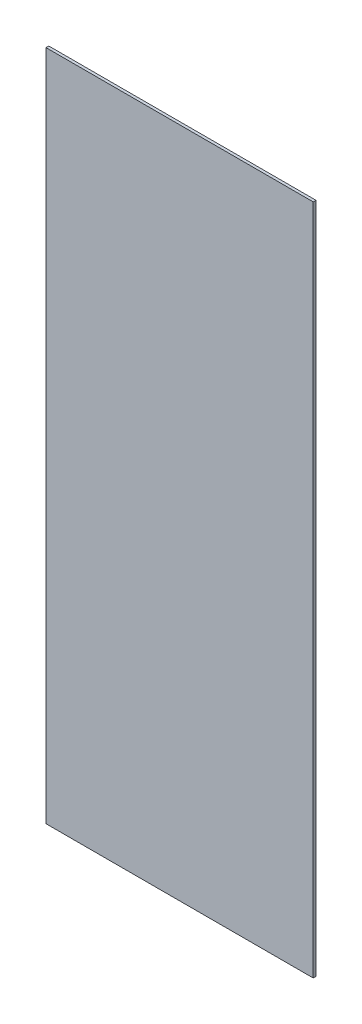
ISO-10303-21;
HEADER;
FILE_DESCRIPTION(('STEP AP214'),'2;1');
FILE_NAME('part.step','',(''),(''),'','','');
FILE_SCHEMA(('AUTOMOTIVE_DESIGN { 1 0 10303 214 1 1 1 1 }'));
ENDSEC;
DATA;
#1=APPLICATION_CONTEXT('core data for automotive mechanical design processes');
#2=APPLICATION_PROTOCOL_DEFINITION('international standard','automotive_design',2000,#1);
#3=PRODUCT_CONTEXT('',#1,'mechanical');
#4=PRODUCT('Part','Part','',(#3));
#5=PRODUCT_RELATED_PRODUCT_CATEGORY('part','',(#4));
#6=PRODUCT_DEFINITION_FORMATION('','',#4);
#7=PRODUCT_DEFINITION_CONTEXT('part definition',#1,'design');
#8=PRODUCT_DEFINITION('design','',#6,#7);
#9=PRODUCT_DEFINITION_SHAPE('','',#8);
#10=(LENGTH_UNIT() NAMED_UNIT(*) SI_UNIT(.MILLI.,.METRE.));
#11=(NAMED_UNIT(*) PLANE_ANGLE_UNIT() SI_UNIT($,.RADIAN.));
#12=(NAMED_UNIT(*) SI_UNIT($,.STERADIAN.) SOLID_ANGLE_UNIT());
#13=UNCERTAINTY_MEASURE_WITH_UNIT(LENGTH_MEASURE(1.E-05),#10,'distance_accuracy_value','');
#14=(GEOMETRIC_REPRESENTATION_CONTEXT(3) GLOBAL_UNCERTAINTY_ASSIGNED_CONTEXT((#13)) GLOBAL_UNIT_ASSIGNED_CONTEXT((#10,
#11,#12)) REPRESENTATION_CONTEXT('',''));
#15=CARTESIAN_POINT('',(0.,0.,0.));
#16=DIRECTION('',(0.,0.,1.));
#17=DIRECTION('',(1.,0.,0.));
#18=AXIS2_PLACEMENT_3D('',#15,#16,#17);
#19=CARTESIAN_POINT('',(767.157776387409,-469.763852669517,2.54));
#20=DIRECTION('',(0.,-1.,0.));
#21=DIRECTION('',(0.,0.,-1.));
#22=AXIS2_PLACEMENT_3D('',#19,#20,#21);
#23=PLANE('',#22);
#24=DIRECTION('',(-1.,0.,0.));
#25=VECTOR('',#24,1.);
#26=CARTESIAN_POINT('',(767.157776387409,-469.763852669517,0.));
#27=LINE('',#26,#25);
#28=CARTESIAN_POINT('',(1010.48977638741,-469.763852669517,0.));
#29=VERTEX_POINT('',#28);
#30=CARTESIAN_POINT('',(767.157776387409,-469.763852669517,0.));
#31=VERTEX_POINT('',#30);
#32=EDGE_CURVE('E95',#29,#31,#27,.T.);
#33=ORIENTED_EDGE('',*,*,#32,.T.);
#34=DIRECTION('',(0.,0.,-1.));
#35=VECTOR('',#34,1.);
#36=CARTESIAN_POINT('',(767.157776387409,-469.763852669517,2.54));
#37=LINE('',#36,#35);
#38=CARTESIAN_POINT('',(767.157776387409,-469.763852669517,2.54));
#39=VERTEX_POINT('',#38);
#40=EDGE_CURVE('E11',#39,#31,#37,.T.);
#41=ORIENTED_EDGE('',*,*,#40,.F.);
#42=DIRECTION('',(-1.,0.,0.));
#43=VECTOR('',#42,1.);
#44=CARTESIAN_POINT('',(767.157776387409,-469.763852669517,2.54));
#45=LINE('',#44,#43);
#46=CARTESIAN_POINT('',(1010.48977638741,-469.763852669517,2.54));
#47=VERTEX_POINT('',#46);
#48=EDGE_CURVE('E83',#47,#39,#45,.T.);
#49=ORIENTED_EDGE('',*,*,#48,.F.);
#50=DIRECTION('',(0.,0.,-1.));
#51=VECTOR('',#50,1.);
#52=CARTESIAN_POINT('',(1010.48977638741,-469.763852669517,2.54));
#53=LINE('',#52,#51);
#54=EDGE_CURVE('E91',#47,#29,#53,.T.);
#55=ORIENTED_EDGE('',*,*,#54,.T.);
#56=EDGE_LOOP('',(#33,#41,#49,#55));
#57=FACE_BOUND('',#56,.T.);
#58=ADVANCED_FACE('F32',(#57),#23,.F.);
#59=CARTESIAN_POINT('',(767.157776387409,-1081.90385266952,2.54));
#60=DIRECTION('',(1.,0.,0.));
#61=DIRECTION('',(0.,0.,-1.));
#62=AXIS2_PLACEMENT_3D('',#59,#60,#61);
#63=PLANE('',#62);
#64=DIRECTION('',(0.,-1.,0.));
#65=VECTOR('',#64,1.);
#66=CARTESIAN_POINT('',(767.157776387409,-1081.90385266952,0.));
#67=LINE('',#66,#65);
#68=CARTESIAN_POINT('',(767.157776387409,-1081.90385266952,0.));
#69=VERTEX_POINT('',#68);
#70=EDGE_CURVE('E87',#31,#69,#67,.T.);
#71=ORIENTED_EDGE('',*,*,#70,.T.);
#72=DIRECTION('',(0.,0.,-1.));
#73=VECTOR('',#72,1.);
#74=CARTESIAN_POINT('',(767.157776387409,-1081.90385266952,2.54));
#75=LINE('',#74,#73);
#76=CARTESIAN_POINT('',(767.157776387409,-1081.90385266952,2.54));
#77=VERTEX_POINT('',#76);
#78=EDGE_CURVE('E40',#77,#69,#75,.T.);
#79=ORIENTED_EDGE('',*,*,#78,.F.);
#80=DIRECTION('',(0.,-1.,0.));
#81=VECTOR('',#80,1.);
#82=CARTESIAN_POINT('',(767.157776387409,-1081.90385266952,2.54));
#83=LINE('',#82,#81);
#84=EDGE_CURVE('E78',#39,#77,#83,.T.);
#85=ORIENTED_EDGE('',*,*,#84,.F.);
#86=ORIENTED_EDGE('',*,*,#40,.T.);
#87=EDGE_LOOP('',(#71,#79,#85,#86));
#88=FACE_BOUND('',#87,.T.);
#89=ADVANCED_FACE('F86',(#88),#63,.F.);
#90=CARTESIAN_POINT('',(1010.48977638741,-1081.90385266952,2.54));
#91=DIRECTION('',(0.,1.,0.));
#92=DIRECTION('',(0.,0.,1.));
#93=AXIS2_PLACEMENT_3D('',#90,#91,#92);
#94=PLANE('',#93);
#95=DIRECTION('',(1.,0.,0.));
#96=VECTOR('',#95,1.);
#97=CARTESIAN_POINT('',(1010.48977638741,-1081.90385266952,0.));
#98=LINE('',#97,#96);
#99=CARTESIAN_POINT('',(1010.48977638741,-1081.90385266952,0.));
#100=VERTEX_POINT('',#99);
#101=EDGE_CURVE('E65',#69,#100,#98,.T.);
#102=ORIENTED_EDGE('',*,*,#101,.T.);
#103=DIRECTION('',(0.,0.,-1.));
#104=VECTOR('',#103,1.);
#105=CARTESIAN_POINT('',(1010.48977638741,-1081.90385266952,2.54));
#106=LINE('',#105,#104);
#107=CARTESIAN_POINT('',(1010.48977638741,-1081.90385266952,2.54));
#108=VERTEX_POINT('',#107);
#109=EDGE_CURVE('E88',#108,#100,#106,.T.);
#110=ORIENTED_EDGE('',*,*,#109,.F.);
#111=DIRECTION('',(1.,0.,0.));
#112=VECTOR('',#111,1.);
#113=CARTESIAN_POINT('',(1010.48977638741,-1081.90385266952,2.54));
#114=LINE('',#113,#112);
#115=EDGE_CURVE('E81',#77,#108,#114,.T.);
#116=ORIENTED_EDGE('',*,*,#115,.F.);
#117=ORIENTED_EDGE('',*,*,#78,.T.);
#118=EDGE_LOOP('',(#102,#110,#116,#117));
#119=FACE_BOUND('',#118,.T.);
#120=ADVANCED_FACE('F89',(#119),#94,.F.);
#121=CARTESIAN_POINT('',(1010.48977638741,-469.763852669517,2.54));
#122=DIRECTION('',(-1.,0.,0.));
#123=DIRECTION('',(0.,0.,1.));
#124=AXIS2_PLACEMENT_3D('',#121,#122,#123);
#125=PLANE('',#124);
#126=DIRECTION('',(0.,1.,0.));
#127=VECTOR('',#126,1.);
#128=CARTESIAN_POINT('',(1010.48977638741,-469.763852669517,0.));
#129=LINE('',#128,#127);
#130=EDGE_CURVE('E71',#100,#29,#129,.T.);
#131=ORIENTED_EDGE('',*,*,#130,.T.);
#132=ORIENTED_EDGE('',*,*,#54,.F.);
#133=DIRECTION('',(0.,1.,0.));
#134=VECTOR('',#133,1.);
#135=CARTESIAN_POINT('',(1010.48977638741,-469.763852669517,2.54));
#136=LINE('',#135,#134);
#137=EDGE_CURVE('E48',#108,#47,#136,.T.);
#138=ORIENTED_EDGE('',*,*,#137,.F.);
#139=ORIENTED_EDGE('',*,*,#109,.T.);
#140=EDGE_LOOP('',(#131,#132,#138,#139));
#141=FACE_BOUND('',#140,.T.);
#142=ADVANCED_FACE('F102',(#141),#125,.F.);
#143=CARTESIAN_POINT('',(0.,0.,2.54));
#144=DIRECTION('',(0.,0.,-1.));
#145=DIRECTION('',(-1.,0.,0.));
#146=AXIS2_PLACEMENT_3D('',#143,#144,#145);
#147=PLANE('',#146);
#148=ORIENTED_EDGE('',*,*,#48,.T.);
#149=ORIENTED_EDGE('',*,*,#84,.T.);
#150=ORIENTED_EDGE('',*,*,#115,.T.);
#151=ORIENTED_EDGE('',*,*,#137,.T.);
#152=EDGE_LOOP('',(#148,#149,#150,#151));
#153=FACE_BOUND('',#152,.T.);
#154=ADVANCED_FACE('F79',(#153),#147,.F.);
#155=CARTESIAN_POINT('',(0.,0.,0.));
#156=DIRECTION('',(0.,0.,-1.));
#157=DIRECTION('',(-1.,0.,0.));
#158=AXIS2_PLACEMENT_3D('',#155,#156,#157);
#159=PLANE('',#158);
#160=ORIENTED_EDGE('',*,*,#32,.F.);
#161=ORIENTED_EDGE('',*,*,#130,.F.);
#162=ORIENTED_EDGE('',*,*,#101,.F.);
#163=ORIENTED_EDGE('',*,*,#70,.F.);
#164=EDGE_LOOP('',(#160,#161,#162,#163));
#165=FACE_BOUND('',#164,.T.);
#166=ADVANCED_FACE('F105',(#165),#159,.T.);
#167=CLOSED_SHELL('',(#58,#89,#120,#142,#154,#166));
#168=MANIFOLD_SOLID_BREP('B2',#167);
#169=ADVANCED_BREP_SHAPE_REPRESENTATION('',(#18,#168),#14);
#170=SHAPE_DEFINITION_REPRESENTATION(#9,#169);
ENDSEC;
END-ISO-10303-21;
